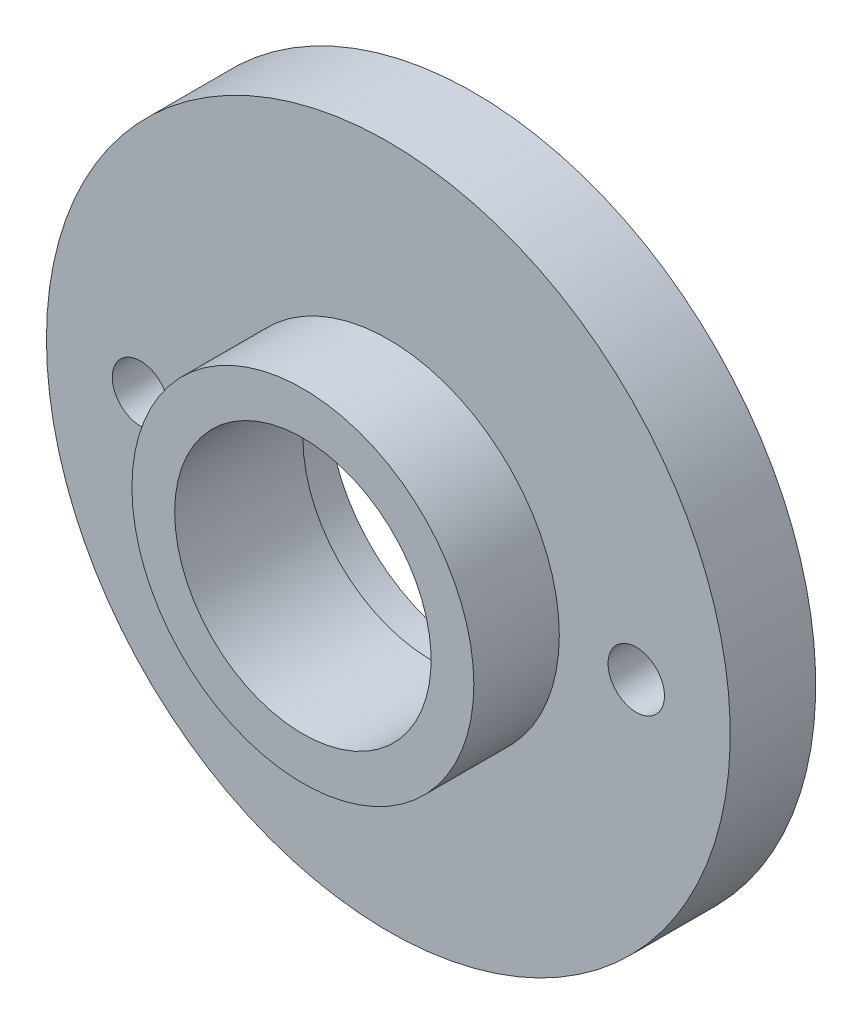
ISO-10303-21;
HEADER;
FILE_DESCRIPTION(('STEP AP214'),'2;1');
FILE_NAME('part.step','',(''),(''),'','','');
FILE_SCHEMA(('AUTOMOTIVE_DESIGN { 1 0 10303 214 1 1 1 1 }'));
ENDSEC;
DATA;
#1=APPLICATION_CONTEXT('core data for automotive mechanical design processes');
#2=APPLICATION_PROTOCOL_DEFINITION('international standard','automotive_design',2000,#1);
#3=PRODUCT_CONTEXT('',#1,'mechanical');
#4=PRODUCT('Part','Part','',(#3));
#5=PRODUCT_RELATED_PRODUCT_CATEGORY('part','',(#4));
#6=PRODUCT_DEFINITION_FORMATION('','',#4);
#7=PRODUCT_DEFINITION_CONTEXT('part definition',#1,'design');
#8=PRODUCT_DEFINITION('design','',#6,#7);
#9=PRODUCT_DEFINITION_SHAPE('','',#8);
#10=(LENGTH_UNIT() NAMED_UNIT(*) SI_UNIT(.MILLI.,.METRE.));
#11=(NAMED_UNIT(*) PLANE_ANGLE_UNIT() SI_UNIT($,.RADIAN.));
#12=(NAMED_UNIT(*) SI_UNIT($,.STERADIAN.) SOLID_ANGLE_UNIT());
#13=UNCERTAINTY_MEASURE_WITH_UNIT(LENGTH_MEASURE(1.E-05),#10,'distance_accuracy_value','');
#14=(GEOMETRIC_REPRESENTATION_CONTEXT(3) GLOBAL_UNCERTAINTY_ASSIGNED_CONTEXT((#13)) GLOBAL_UNIT_ASSIGNED_CONTEXT((#10,
#11,#12)) REPRESENTATION_CONTEXT('',''));
#15=CARTESIAN_POINT('',(0.,0.,0.));
#16=DIRECTION('',(0.,0.,1.));
#17=DIRECTION('',(1.,0.,0.));
#18=AXIS2_PLACEMENT_3D('',#15,#16,#17);
#19=CARTESIAN_POINT('',(0.,0.,-17.3797052154195));
#20=DIRECTION('',(0.,0.,-1.));
#21=DIRECTION('',(-1.,0.,0.));
#22=AXIS2_PLACEMENT_3D('',#19,#20,#21);
#23=CYLINDRICAL_SURFACE('',#22,7.50000000002449);
#24=CARTESIAN_POINT('',(0.,0.,5.));
#25=DIRECTION('',(0.,0.,-1.));
#26=DIRECTION('',(-1.,0.,0.));
#27=AXIS2_PLACEMENT_3D('',#24,#25,#26);
#28=CIRCLE('',#27,7.50000000002449);
#29=CARTESIAN_POINT('',(-7.50000000002449,0.,5.));
#30=VERTEX_POINT('',#29);
#31=EDGE_CURVE('E10',#30,#30,#28,.T.);
#32=ORIENTED_EDGE('',*,*,#31,.F.);
#33=EDGE_LOOP('',(#32));
#34=FACE_BOUND('',#33,.T.);
#35=CARTESIAN_POINT('',(0.,0.,-2.5));
#36=DIRECTION('',(0.,0.,-1.));
#37=DIRECTION('',(-1.,0.,0.));
#38=AXIS2_PLACEMENT_3D('',#35,#36,#37);
#39=CIRCLE('',#38,7.50000000002449);
#40=CARTESIAN_POINT('',(-7.50000000002449,0.,-2.5));
#41=VERTEX_POINT('',#40);
#42=EDGE_CURVE('E63',#41,#41,#39,.T.);
#43=ORIENTED_EDGE('',*,*,#42,.T.);
#44=EDGE_LOOP('',(#43));
#45=FACE_BOUND('',#44,.T.);
#46=ADVANCED_FACE('F35',(#34,#45),#23,.F.);
#47=CARTESIAN_POINT('',(7.5000000000245,0.,5.));
#48=DIRECTION('',(0.,0.,-1.));
#49=DIRECTION('',(-1.,0.,0.));
#50=AXIS2_PLACEMENT_3D('',#47,#48,#49);
#51=PLANE('',#50);
#52=CARTESIAN_POINT('',(0.,0.,5.));
#53=DIRECTION('',(0.,0.,-1.));
#54=DIRECTION('',(-1.,0.,0.));
#55=AXIS2_PLACEMENT_3D('',#52,#53,#54);
#56=CIRCLE('',#55,10.0000000000245);
#57=CARTESIAN_POINT('',(-10.0000000000245,0.,5.));
#58=VERTEX_POINT('',#57);
#59=EDGE_CURVE('E41',#58,#58,#56,.T.);
#60=ORIENTED_EDGE('',*,*,#59,.F.);
#61=EDGE_LOOP('',(#60));
#62=FACE_BOUND('',#61,.T.);
#63=ORIENTED_EDGE('',*,*,#31,.T.);
#64=EDGE_LOOP('',(#63));
#65=FACE_BOUND('',#64,.T.);
#66=ADVANCED_FACE('F94',(#62,#65),#51,.F.);
#67=CARTESIAN_POINT('',(0.,0.,-17.3797052154195));
#68=DIRECTION('',(0.,0.,-1.));
#69=DIRECTION('',(-1.,0.,0.));
#70=AXIS2_PLACEMENT_3D('',#67,#68,#69);
#71=CYLINDRICAL_SURFACE('',#70,10.0000000000245);
#72=CARTESIAN_POINT('',(0.,0.,0.));
#73=DIRECTION('',(0.,0.,-1.));
#74=DIRECTION('',(-1.,0.,0.));
#75=AXIS2_PLACEMENT_3D('',#72,#73,#74);
#76=CIRCLE('',#75,10.0000000000245);
#77=CARTESIAN_POINT('',(-10.0000000000245,0.,0.));
#78=VERTEX_POINT('',#77);
#79=EDGE_CURVE('E45',#78,#78,#76,.T.);
#80=ORIENTED_EDGE('',*,*,#79,.F.);
#81=EDGE_LOOP('',(#80));
#82=FACE_BOUND('',#81,.T.);
#83=ORIENTED_EDGE('',*,*,#59,.T.);
#84=EDGE_LOOP('',(#83));
#85=FACE_BOUND('',#84,.T.);
#86=ADVANCED_FACE('F85',(#82,#85),#71,.T.);
#87=CARTESIAN_POINT('',(10.0000000000245,0.,0.));
#88=DIRECTION('',(0.,0.,-1.));
#89=DIRECTION('',(-1.,0.,0.));
#90=AXIS2_PLACEMENT_3D('',#87,#88,#89);
#91=PLANE('',#90);
#92=CARTESIAN_POINT('',(-14.5,0.,0.));
#93=DIRECTION('',(0.,0.,1.));
#94=DIRECTION('',(1.,0.,0.));
#95=AXIS2_PLACEMENT_3D('',#92,#93,#94);
#96=CIRCLE('',#95,1.64999999999999);
#97=CARTESIAN_POINT('',(-12.85,0.,0.));
#98=VERTEX_POINT('',#97);
#99=EDGE_CURVE('E75',#98,#98,#96,.T.);
#100=ORIENTED_EDGE('',*,*,#99,.F.);
#101=EDGE_LOOP('',(#100));
#102=FACE_BOUND('',#101,.T.);
#103=CARTESIAN_POINT('',(14.5,0.,0.));
#104=DIRECTION('',(0.,0.,1.));
#105=DIRECTION('',(1.,0.,0.));
#106=AXIS2_PLACEMENT_3D('',#103,#104,#105);
#107=CIRCLE('',#106,1.64999999999999);
#108=CARTESIAN_POINT('',(16.15,0.,0.));
#109=VERTEX_POINT('',#108);
#110=EDGE_CURVE('E69',#109,#109,#107,.T.);
#111=ORIENTED_EDGE('',*,*,#110,.F.);
#112=EDGE_LOOP('',(#111));
#113=FACE_BOUND('',#112,.T.);
#114=CARTESIAN_POINT('',(0.,0.,0.));
#115=DIRECTION('',(0.,0.,-1.));
#116=DIRECTION('',(-1.,0.,0.));
#117=AXIS2_PLACEMENT_3D('',#114,#115,#116);
#118=CIRCLE('',#117,20.0000000000245);
#119=CARTESIAN_POINT('',(-20.0000000000245,0.,0.));
#120=VERTEX_POINT('',#119);
#121=EDGE_CURVE('E49',#120,#120,#118,.T.);
#122=ORIENTED_EDGE('',*,*,#121,.F.);
#123=EDGE_LOOP('',(#122));
#124=FACE_BOUND('',#123,.T.);
#125=ORIENTED_EDGE('',*,*,#79,.T.);
#126=EDGE_LOOP('',(#125));
#127=FACE_BOUND('',#126,.T.);
#128=ADVANCED_FACE('F81',(#102,#113,#124,#127),#91,.F.);
#129=CARTESIAN_POINT('',(0.,0.,-17.3797052154195));
#130=DIRECTION('',(0.,0.,-1.));
#131=DIRECTION('',(-1.,0.,0.));
#132=AXIS2_PLACEMENT_3D('',#129,#130,#131);
#133=CYLINDRICAL_SURFACE('',#132,20.0000000000245);
#134=CARTESIAN_POINT('',(0.,0.,-5.));
#135=DIRECTION('',(0.,0.,-1.));
#136=DIRECTION('',(-1.,0.,0.));
#137=AXIS2_PLACEMENT_3D('',#134,#135,#136);
#138=CIRCLE('',#137,20.0000000000245);
#139=CARTESIAN_POINT('',(-20.0000000000245,0.,-5.));
#140=VERTEX_POINT('',#139);
#141=EDGE_CURVE('E54',#140,#140,#138,.T.);
#142=ORIENTED_EDGE('',*,*,#141,.F.);
#143=EDGE_LOOP('',(#142));
#144=FACE_BOUND('',#143,.T.);
#145=ORIENTED_EDGE('',*,*,#121,.T.);
#146=EDGE_LOOP('',(#145));
#147=FACE_BOUND('',#146,.T.);
#148=ADVANCED_FACE('F84',(#144,#147),#133,.T.);
#149=CARTESIAN_POINT('',(20.0000000000245,0.,-5.));
#150=DIRECTION('',(0.,0.,1.));
#151=DIRECTION('',(1.,0.,0.));
#152=AXIS2_PLACEMENT_3D('',#149,#150,#151);
#153=PLANE('',#152);
#154=CARTESIAN_POINT('',(-14.5,0.,-5.));
#155=DIRECTION('',(0.,0.,1.));
#156=DIRECTION('',(1.,0.,0.));
#157=AXIS2_PLACEMENT_3D('',#154,#155,#156);
#158=CIRCLE('',#157,1.64999999999999);
#159=CARTESIAN_POINT('',(-12.85,0.,-5.));
#160=VERTEX_POINT('',#159);
#161=EDGE_CURVE('E72',#160,#160,#158,.T.);
#162=ORIENTED_EDGE('',*,*,#161,.T.);
#163=EDGE_LOOP('',(#162));
#164=FACE_BOUND('',#163,.T.);
#165=CARTESIAN_POINT('',(14.5,0.,-5.));
#166=DIRECTION('',(0.,0.,1.));
#167=DIRECTION('',(1.,0.,0.));
#168=AXIS2_PLACEMENT_3D('',#165,#166,#167);
#169=CIRCLE('',#168,1.64999999999999);
#170=CARTESIAN_POINT('',(16.15,0.,-5.));
#171=VERTEX_POINT('',#170);
#172=EDGE_CURVE('E66',#171,#171,#169,.T.);
#173=ORIENTED_EDGE('',*,*,#172,.T.);
#174=EDGE_LOOP('',(#173));
#175=FACE_BOUND('',#174,.T.);
#176=CARTESIAN_POINT('',(0.,0.,-5.));
#177=DIRECTION('',(0.,0.,-1.));
#178=DIRECTION('',(-1.,0.,0.));
#179=AXIS2_PLACEMENT_3D('',#176,#177,#178);
#180=CIRCLE('',#179,8.50000000002449);
#181=CARTESIAN_POINT('',(-8.50000000002449,0.,-5.));
#182=VERTEX_POINT('',#181);
#183=EDGE_CURVE('E57',#182,#182,#180,.T.);
#184=ORIENTED_EDGE('',*,*,#183,.F.);
#185=EDGE_LOOP('',(#184));
#186=FACE_BOUND('',#185,.T.);
#187=ORIENTED_EDGE('',*,*,#141,.T.);
#188=EDGE_LOOP('',(#187));
#189=FACE_BOUND('',#188,.T.);
#190=ADVANCED_FACE('F117',(#164,#175,#186,#189),#153,.F.);
#191=CARTESIAN_POINT('',(0.,0.,-17.3797052154195));
#192=DIRECTION('',(0.,0.,-1.));
#193=DIRECTION('',(-1.,0.,0.));
#194=AXIS2_PLACEMENT_3D('',#191,#192,#193);
#195=CYLINDRICAL_SURFACE('',#194,8.50000000002449);
#196=CARTESIAN_POINT('',(0.,0.,-2.5));
#197=DIRECTION('',(0.,0.,-1.));
#198=DIRECTION('',(-1.,0.,0.));
#199=AXIS2_PLACEMENT_3D('',#196,#197,#198);
#200=CIRCLE('',#199,8.50000000002449);
#201=CARTESIAN_POINT('',(-8.50000000002449,0.,-2.5));
#202=VERTEX_POINT('',#201);
#203=EDGE_CURVE('E60',#202,#202,#200,.T.);
#204=ORIENTED_EDGE('',*,*,#203,.F.);
#205=EDGE_LOOP('',(#204));
#206=FACE_BOUND('',#205,.T.);
#207=ORIENTED_EDGE('',*,*,#183,.T.);
#208=EDGE_LOOP('',(#207));
#209=FACE_BOUND('',#208,.T.);
#210=ADVANCED_FACE('F111',(#206,#209),#195,.F.);
#211=CARTESIAN_POINT('',(8.50000000002449,0.,-2.5));
#212=DIRECTION('',(0.,0.,1.));
#213=DIRECTION('',(1.,0.,0.));
#214=AXIS2_PLACEMENT_3D('',#211,#212,#213);
#215=PLANE('',#214);
#216=ORIENTED_EDGE('',*,*,#42,.F.);
#217=EDGE_LOOP('',(#216));
#218=FACE_BOUND('',#217,.T.);
#219=ORIENTED_EDGE('',*,*,#203,.T.);
#220=EDGE_LOOP('',(#219));
#221=FACE_BOUND('',#220,.T.);
#222=ADVANCED_FACE('F107',(#218,#221),#215,.F.);
#223=CARTESIAN_POINT('',(14.5,0.,0.));
#224=DIRECTION('',(0.,0.,1.));
#225=DIRECTION('',(1.,0.,0.));
#226=AXIS2_PLACEMENT_3D('',#223,#224,#225);
#227=CYLINDRICAL_SURFACE('',#226,1.64999999999999);
#228=ORIENTED_EDGE('',*,*,#172,.F.);
#229=EDGE_LOOP('',(#228));
#230=FACE_BOUND('',#229,.T.);
#231=ORIENTED_EDGE('',*,*,#110,.T.);
#232=EDGE_LOOP('',(#231));
#233=FACE_BOUND('',#232,.T.);
#234=ADVANCED_FACE('F110',(#230,#233),#227,.F.);
#235=CARTESIAN_POINT('',(-14.5,0.,0.));
#236=DIRECTION('',(0.,0.,1.));
#237=DIRECTION('',(1.,0.,0.));
#238=AXIS2_PLACEMENT_3D('',#235,#236,#237);
#239=CYLINDRICAL_SURFACE('',#238,1.64999999999999);
#240=ORIENTED_EDGE('',*,*,#161,.F.);
#241=EDGE_LOOP('',(#240));
#242=FACE_BOUND('',#241,.T.);
#243=ORIENTED_EDGE('',*,*,#99,.T.);
#244=EDGE_LOOP('',(#243));
#245=FACE_BOUND('',#244,.T.);
#246=ADVANCED_FACE('F79',(#242,#245),#239,.F.);
#247=CLOSED_SHELL('',(#46,#66,#86,#128,#148,#190,#210,#222,#234,#246));
#248=MANIFOLD_SOLID_BREP('B2',#247);
#249=ADVANCED_BREP_SHAPE_REPRESENTATION('',(#18,#248),#14);
#250=SHAPE_DEFINITION_REPRESENTATION(#9,#249);
ENDSEC;
END-ISO-10303-21;
